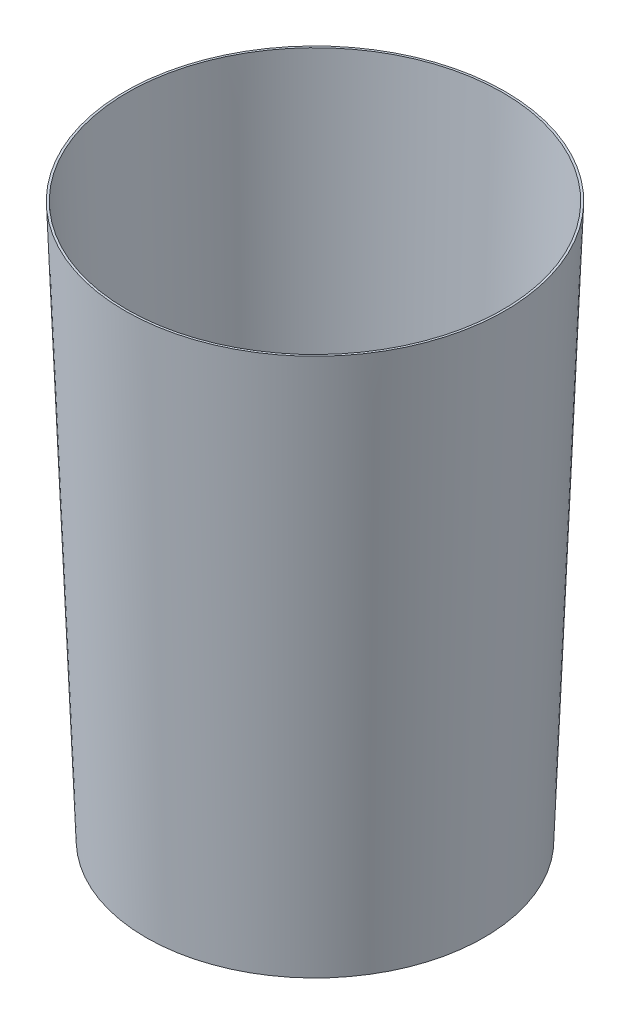
ISO-10303-21;
HEADER;
FILE_DESCRIPTION(('STEP AP214'),'2;1');
FILE_NAME('part.step','',(''),(''),'','','');
FILE_SCHEMA(('AUTOMOTIVE_DESIGN { 1 0 10303 214 1 1 1 1 }'));
ENDSEC;
DATA;
#1=APPLICATION_CONTEXT('core data for automotive mechanical design processes');
#2=APPLICATION_PROTOCOL_DEFINITION('international standard','automotive_design',2000,#1);
#3=PRODUCT_CONTEXT('',#1,'mechanical');
#4=PRODUCT('Part','Part','',(#3));
#5=PRODUCT_RELATED_PRODUCT_CATEGORY('part','',(#4));
#6=PRODUCT_DEFINITION_FORMATION('','',#4);
#7=PRODUCT_DEFINITION_CONTEXT('part definition',#1,'design');
#8=PRODUCT_DEFINITION('design','',#6,#7);
#9=PRODUCT_DEFINITION_SHAPE('','',#8);
#10=(LENGTH_UNIT() NAMED_UNIT(*) SI_UNIT(.MILLI.,.METRE.));
#11=(NAMED_UNIT(*) PLANE_ANGLE_UNIT() SI_UNIT($,.RADIAN.));
#12=(NAMED_UNIT(*) SI_UNIT($,.STERADIAN.) SOLID_ANGLE_UNIT());
#13=UNCERTAINTY_MEASURE_WITH_UNIT(LENGTH_MEASURE(1.E-05),#10,'distance_accuracy_value','');
#14=(GEOMETRIC_REPRESENTATION_CONTEXT(3) GLOBAL_UNCERTAINTY_ASSIGNED_CONTEXT((#13)) GLOBAL_UNIT_ASSIGNED_CONTEXT((#10,
#11,#12)) REPRESENTATION_CONTEXT('',''));
#15=CARTESIAN_POINT('',(0.,0.,0.));
#16=DIRECTION('',(0.,0.,1.));
#17=DIRECTION('',(1.,0.,0.));
#18=AXIS2_PLACEMENT_3D('',#15,#16,#17);
#19=CARTESIAN_POINT('',(0.,63.,0.));
#20=DIRECTION('',(0.,1.,0.));
#21=DIRECTION('',(0.,0.,1.));
#22=AXIS2_PLACEMENT_3D('',#19,#20,#21);
#23=CONICAL_SURFACE('',#22,40.,0.0381348796889019);
#24=CARTESIAN_POINT('',(0.,194.05,0.));
#25=DIRECTION('',(0.,-1.,0.));
#26=DIRECTION('',(0.,0.,-1.));
#27=AXIS2_PLACEMENT_3D('',#24,#25,#26);
#28=CIRCLE('',#27,45.);
#29=CARTESIAN_POINT('',(0.,194.05,-45.));
#30=VERTEX_POINT('',#29);
#31=EDGE_CURVE('E11',#30,#30,#28,.T.);
#32=ORIENTED_EDGE('',*,*,#31,.T.);
#33=EDGE_LOOP('',(#32));
#34=FACE_BOUND('',#33,.T.);
#35=CARTESIAN_POINT('',(0.,63.,0.));
#36=DIRECTION('',(0.,1.,0.));
#37=DIRECTION('',(0.,0.,1.));
#38=AXIS2_PLACEMENT_3D('',#35,#36,#37);
#39=CIRCLE('',#38,40.);
#40=CARTESIAN_POINT('',(0.,63.,40.));
#41=VERTEX_POINT('',#40);
#42=EDGE_CURVE('E63',#41,#41,#39,.F.);
#43=ORIENTED_EDGE('',*,*,#42,.F.);
#44=EDGE_LOOP('',(#43));
#45=FACE_BOUND('',#44,.T.);
#46=ADVANCED_FACE('F55',(#34,#45),#23,.T.);
#47=CARTESIAN_POINT('',(0.,194.05,0.));
#48=DIRECTION('',(0.,-1.,0.));
#49=DIRECTION('',(0.,0.,-1.));
#50=AXIS2_PLACEMENT_3D('',#47,#48,#49);
#51=PLANE('',#50);
#52=CARTESIAN_POINT('',(0.,194.05,0.));
#53=DIRECTION('',(0.,-1.,0.));
#54=DIRECTION('',(0.,0.,-1.));
#55=AXIS2_PLACEMENT_3D('',#52,#53,#54);
#56=CIRCLE('',#55,44.4996362123055);
#57=CARTESIAN_POINT('',(0.,194.05,-44.4996362123055));
#58=VERTEX_POINT('',#57);
#59=EDGE_CURVE('E69',#58,#58,#56,.T.);
#60=ORIENTED_EDGE('',*,*,#59,.T.);
#61=EDGE_LOOP('',(#60));
#62=FACE_BOUND('',#61,.T.);
#63=ORIENTED_EDGE('',*,*,#31,.F.);
#64=EDGE_LOOP('',(#63));
#65=FACE_BOUND('',#64,.T.);
#66=ADVANCED_FACE('F78',(#62,#65),#51,.F.);
#67=CARTESIAN_POINT('',(0.,63.,0.));
#68=DIRECTION('',(0.,1.,0.));
#69=DIRECTION('',(0.,0.,1.));
#70=AXIS2_PLACEMENT_3D('',#67,#68,#69);
#71=PLANE('',#70);
#72=ORIENTED_EDGE('',*,*,#42,.T.);
#73=EDGE_LOOP('',(#72));
#74=FACE_BOUND('',#73,.T.);
#75=ADVANCED_FACE('F87',(#74),#71,.F.);
#76=CARTESIAN_POINT('',(0.,63.0190628186492,0.));
#77=DIRECTION('',(0.,1.,0.));
#78=DIRECTION('',(0.,0.,1.));
#79=AXIS2_PLACEMENT_3D('',#76,#77,#78);
#80=CONICAL_SURFACE('',#79,39.500363523204,0.0381348796889019);
#81=ORIENTED_EDGE('',*,*,#59,.F.);
#82=EDGE_LOOP('',(#81));
#83=FACE_BOUND('',#82,.T.);
#84=CARTESIAN_POINT('',(0.,63.5,0.));
#85=DIRECTION('',(0.,1.,0.));
#86=DIRECTION('',(0.,0.,1.));
#87=AXIS2_PLACEMENT_3D('',#84,#85,#86);
#88=CIRCLE('',#87,39.5187129005924);
#89=CARTESIAN_POINT('',(0.,63.5,39.5187129005924));
#90=VERTEX_POINT('',#89);
#91=EDGE_CURVE('E160',#90,#90,#88,.F.);
#92=ORIENTED_EDGE('',*,*,#91,.T.);
#93=EDGE_LOOP('',(#92));
#94=FACE_BOUND('',#93,.T.);
#95=ADVANCED_FACE('F93',(#83,#94),#80,.F.);
#96=CARTESIAN_POINT('',(0.,63.5,0.));
#97=DIRECTION('',(0.,1.,0.));
#98=DIRECTION('',(0.,0.,1.));
#99=AXIS2_PLACEMENT_3D('',#96,#97,#98);
#100=PLANE('',#99);
#101=ORIENTED_EDGE('',*,*,#91,.F.);
#102=EDGE_LOOP('',(#101));
#103=FACE_BOUND('',#102,.T.);
#104=ADVANCED_FACE('F89',(#103),#100,.T.);
#105=CLOSED_SHELL('',(#46,#66,#75,#95,#104));
#106=MANIFOLD_SOLID_BREP('B2',#105);
#107=ADVANCED_BREP_SHAPE_REPRESENTATION('',(#18,#106),#14);
#108=SHAPE_DEFINITION_REPRESENTATION(#9,#107);
ENDSEC;
END-ISO-10303-21;
